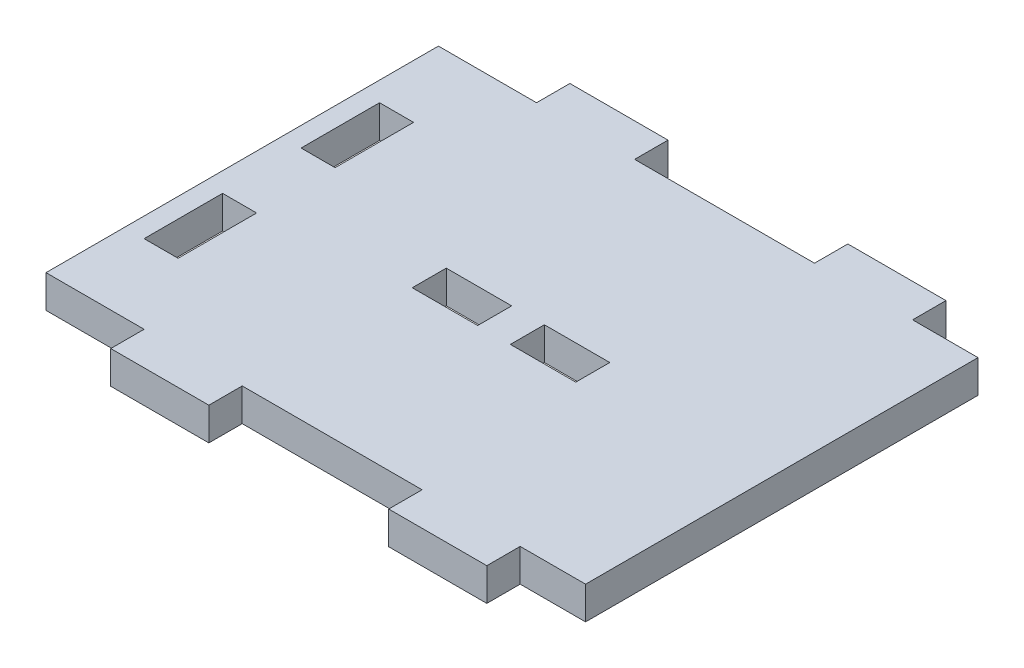
ISO-10303-21;
HEADER;
FILE_DESCRIPTION(('STEP AP214'),'2;1');
FILE_NAME('part.step','',(''),(''),'','','');
FILE_SCHEMA(('AUTOMOTIVE_DESIGN { 1 0 10303 214 1 1 1 1 }'));
ENDSEC;
DATA;
#1=APPLICATION_CONTEXT('core data for automotive mechanical design processes');
#2=APPLICATION_PROTOCOL_DEFINITION('international standard','automotive_design',2000,#1);
#3=PRODUCT_CONTEXT('',#1,'mechanical');
#4=PRODUCT('Part','Part','',(#3));
#5=PRODUCT_RELATED_PRODUCT_CATEGORY('part','',(#4));
#6=PRODUCT_DEFINITION_FORMATION('','',#4);
#7=PRODUCT_DEFINITION_CONTEXT('part definition',#1,'design');
#8=PRODUCT_DEFINITION('design','',#6,#7);
#9=PRODUCT_DEFINITION_SHAPE('','',#8);
#10=(LENGTH_UNIT() NAMED_UNIT(*) SI_UNIT(.MILLI.,.METRE.));
#11=(NAMED_UNIT(*) PLANE_ANGLE_UNIT() SI_UNIT($,.RADIAN.));
#12=(NAMED_UNIT(*) SI_UNIT($,.STERADIAN.) SOLID_ANGLE_UNIT());
#13=UNCERTAINTY_MEASURE_WITH_UNIT(LENGTH_MEASURE(1.E-05),#10,'distance_accuracy_value','');
#14=(GEOMETRIC_REPRESENTATION_CONTEXT(3) GLOBAL_UNCERTAINTY_ASSIGNED_CONTEXT((#13)) GLOBAL_UNIT_ASSIGNED_CONTEXT((#10,
#11,#12)) REPRESENTATION_CONTEXT('',''));
#15=CARTESIAN_POINT('',(0.,0.,0.));
#16=DIRECTION('',(0.,0.,1.));
#17=DIRECTION('',(1.,0.,0.));
#18=AXIS2_PLACEMENT_3D('',#15,#16,#17);
#19=CARTESIAN_POINT('',(0.,5.,0.));
#20=DIRECTION('',(0.,1.,0.));
#21=DIRECTION('',(0.,0.,1.));
#22=AXIS2_PLACEMENT_3D('',#19,#20,#21);
#23=PLANE('',#22);
#24=DIRECTION('',(1.,0.,0.));
#25=VECTOR('',#24,1.);
#26=CARTESIAN_POINT('',(25.,5.,30.));
#27=LINE('',#26,#25);
#28=CARTESIAN_POINT('',(15.,5.,30.));
#29=VERTEX_POINT('',#28);
#30=CARTESIAN_POINT('',(25.,5.,30.));
#31=VERTEX_POINT('',#30);
#32=EDGE_CURVE('E399',#29,#31,#27,.T.);
#33=ORIENTED_EDGE('',*,*,#32,.T.);
#34=DIRECTION('',(0.,0.,-1.));
#35=VECTOR('',#34,1.);
#36=CARTESIAN_POINT('',(25.,5.,-30.));
#37=LINE('',#36,#35);
#38=CARTESIAN_POINT('',(25.,5.,-30.));
#39=VERTEX_POINT('',#38);
#40=EDGE_CURVE('E402',#31,#39,#37,.T.);
#41=ORIENTED_EDGE('',*,*,#40,.T.);
#42=DIRECTION('',(-1.,0.,0.));
#43=VECTOR('',#42,1.);
#44=CARTESIAN_POINT('',(25.,5.,-30.));
#45=LINE('',#44,#43);
#46=CARTESIAN_POINT('',(15.,5.,-30.0000000000001));
#47=VERTEX_POINT('',#46);
#48=EDGE_CURVE('E405',#39,#47,#45,.T.);
#49=ORIENTED_EDGE('',*,*,#48,.T.);
#50=DIRECTION('',(0.,0.,-1.));
#51=VECTOR('',#50,1.);
#52=CARTESIAN_POINT('',(15.,5.,-30.0000000000001));
#53=LINE('',#52,#51);
#54=CARTESIAN_POINT('',(15.,5.,-35.1000000000001));
#55=VERTEX_POINT('',#54);
#56=EDGE_CURVE('E407',#47,#55,#53,.T.);
#57=ORIENTED_EDGE('',*,*,#56,.T.);
#58=DIRECTION('',(-1.,0.,0.));
#59=VECTOR('',#58,1.);
#60=CARTESIAN_POINT('',(15.,5.,-35.1000000000001));
#61=LINE('',#60,#59);
#62=CARTESIAN_POINT('',(0.,5.,-35.1));
#63=VERTEX_POINT('',#62);
#64=EDGE_CURVE('E409',#55,#63,#61,.T.);
#65=ORIENTED_EDGE('',*,*,#64,.T.);
#66=DIRECTION('',(0.,0.,1.));
#67=VECTOR('',#66,1.);
#68=CARTESIAN_POINT('',(0.,5.,-35.1));
#69=LINE('',#68,#67);
#70=CARTESIAN_POINT('',(0.,5.,-30.));
#71=VERTEX_POINT('',#70);
#72=EDGE_CURVE('E411',#63,#71,#69,.T.);
#73=ORIENTED_EDGE('',*,*,#72,.T.);
#74=DIRECTION('',(-1.,0.,0.));
#75=VECTOR('',#74,1.);
#76=CARTESIAN_POINT('',(0.,5.,-30.));
#77=LINE('',#76,#75);
#78=CARTESIAN_POINT('',(-27.5,5.,-30.));
#79=VERTEX_POINT('',#78);
#80=EDGE_CURVE('E413',#71,#79,#77,.T.);
#81=ORIENTED_EDGE('',*,*,#80,.T.);
#82=DIRECTION('',(0.,0.,-1.));
#83=VECTOR('',#82,1.);
#84=CARTESIAN_POINT('',(-27.5,5.,-30.));
#85=LINE('',#84,#83);
#86=CARTESIAN_POINT('',(-27.5,5.,-35.1));
#87=VERTEX_POINT('',#86);
#88=EDGE_CURVE('E415',#79,#87,#85,.T.);
#89=ORIENTED_EDGE('',*,*,#88,.T.);
#90=DIRECTION('',(-1.,0.,0.));
#91=VECTOR('',#90,1.);
#92=CARTESIAN_POINT('',(-27.5,5.,-35.1));
#93=LINE('',#92,#91);
#94=CARTESIAN_POINT('',(-42.5,5.,-35.1));
#95=VERTEX_POINT('',#94);
#96=EDGE_CURVE('E417',#87,#95,#93,.T.);
#97=ORIENTED_EDGE('',*,*,#96,.T.);
#98=DIRECTION('',(0.,0.,1.));
#99=VECTOR('',#98,1.);
#100=CARTESIAN_POINT('',(-42.5,5.,-35.1));
#101=LINE('',#100,#99);
#102=CARTESIAN_POINT('',(-42.5,5.,-30.));
#103=VERTEX_POINT('',#102);
#104=EDGE_CURVE('E419',#95,#103,#101,.T.);
#105=ORIENTED_EDGE('',*,*,#104,.T.);
#106=DIRECTION('',(-1.,0.,0.));
#107=VECTOR('',#106,1.);
#108=CARTESIAN_POINT('',(-42.5,5.,-30.));
#109=LINE('',#108,#107);
#110=CARTESIAN_POINT('',(-57.5,5.,-30.));
#111=VERTEX_POINT('',#110);
#112=EDGE_CURVE('E421',#103,#111,#109,.T.);
#113=ORIENTED_EDGE('',*,*,#112,.T.);
#114=DIRECTION('',(0.,0.,1.));
#115=VECTOR('',#114,1.);
#116=CARTESIAN_POINT('',(-57.5,5.,30.));
#117=LINE('',#116,#115);
#118=CARTESIAN_POINT('',(-57.5,5.,30.));
#119=VERTEX_POINT('',#118);
#120=EDGE_CURVE('E423',#111,#119,#117,.T.);
#121=ORIENTED_EDGE('',*,*,#120,.T.);
#122=DIRECTION('',(1.,0.,0.));
#123=VECTOR('',#122,1.);
#124=CARTESIAN_POINT('',(-42.5,5.,30.));
#125=LINE('',#124,#123);
#126=CARTESIAN_POINT('',(-42.5,5.,30.));
#127=VERTEX_POINT('',#126);
#128=EDGE_CURVE('E425',#119,#127,#125,.T.);
#129=ORIENTED_EDGE('',*,*,#128,.T.);
#130=DIRECTION('',(0.,0.,1.));
#131=VECTOR('',#130,1.);
#132=CARTESIAN_POINT('',(-42.5,5.,35.1));
#133=LINE('',#132,#131);
#134=CARTESIAN_POINT('',(-42.5,5.,35.1));
#135=VERTEX_POINT('',#134);
#136=EDGE_CURVE('E427',#127,#135,#133,.T.);
#137=ORIENTED_EDGE('',*,*,#136,.T.);
#138=DIRECTION('',(1.,0.,0.));
#139=VECTOR('',#138,1.);
#140=CARTESIAN_POINT('',(-27.5,5.,35.1));
#141=LINE('',#140,#139);
#142=CARTESIAN_POINT('',(-27.5,5.,35.1));
#143=VERTEX_POINT('',#142);
#144=EDGE_CURVE('E429',#135,#143,#141,.T.);
#145=ORIENTED_EDGE('',*,*,#144,.T.);
#146=DIRECTION('',(0.,0.,-1.));
#147=VECTOR('',#146,1.);
#148=CARTESIAN_POINT('',(-27.5,5.,30.));
#149=LINE('',#148,#147);
#150=CARTESIAN_POINT('',(-27.5,5.,30.));
#151=VERTEX_POINT('',#150);
#152=EDGE_CURVE('E431',#143,#151,#149,.T.);
#153=ORIENTED_EDGE('',*,*,#152,.T.);
#154=DIRECTION('',(1.,0.,0.));
#155=VECTOR('',#154,1.);
#156=CARTESIAN_POINT('',(0.,5.,30.));
#157=LINE('',#156,#155);
#158=CARTESIAN_POINT('',(0.,5.,30.));
#159=VERTEX_POINT('',#158);
#160=EDGE_CURVE('E433',#151,#159,#157,.T.);
#161=ORIENTED_EDGE('',*,*,#160,.T.);
#162=DIRECTION('',(0.,0.,1.));
#163=VECTOR('',#162,1.);
#164=CARTESIAN_POINT('',(0.,5.,35.1));
#165=LINE('',#164,#163);
#166=CARTESIAN_POINT('',(0.,5.,35.1));
#167=VERTEX_POINT('',#166);
#168=EDGE_CURVE('E435',#159,#167,#165,.T.);
#169=ORIENTED_EDGE('',*,*,#168,.T.);
#170=DIRECTION('',(1.,0.,0.));
#171=VECTOR('',#170,1.);
#172=CARTESIAN_POINT('',(15.,5.,35.1));
#173=LINE('',#172,#171);
#174=CARTESIAN_POINT('',(15.,5.,35.1));
#175=VERTEX_POINT('',#174);
#176=EDGE_CURVE('E437',#167,#175,#173,.T.);
#177=ORIENTED_EDGE('',*,*,#176,.T.);
#178=DIRECTION('',(0.,0.,-1.));
#179=VECTOR('',#178,1.);
#180=CARTESIAN_POINT('',(15.,5.,30.));
#181=LINE('',#180,#179);
#182=EDGE_CURVE('E439',#175,#29,#181,.T.);
#183=ORIENTED_EDGE('',*,*,#182,.T.);
#184=EDGE_LOOP('',(#33,#41,#49,#57,#65,#73,#81,#89,#97,#105,#113,#121,#129,#137,#145,#153,#161,
#169,#177,#183));
#185=FACE_BOUND('',#184,.T.);
#186=DIRECTION('',(-1.,0.,0.));
#187=VECTOR('',#186,1.);
#188=CARTESIAN_POINT('',(-27.5,5.,-1.2));
#189=LINE('',#188,#187);
#190=CARTESIAN_POINT('',(-17.5,5.,-1.2));
#191=VERTEX_POINT('',#190);
#192=CARTESIAN_POINT('',(-27.5,5.,-1.2));
#193=VERTEX_POINT('',#192);
#194=EDGE_CURVE('E370',#191,#193,#189,.T.);
#195=ORIENTED_EDGE('',*,*,#194,.F.);
#196=DIRECTION('',(0.,0.,-1.));
#197=VECTOR('',#196,1.);
#198=CARTESIAN_POINT('',(-17.5,5.,-1.2));
#199=LINE('',#198,#197);
#200=CARTESIAN_POINT('',(-17.5,5.,4.));
#201=VERTEX_POINT('',#200);
#202=EDGE_CURVE('E368',#201,#191,#199,.T.);
#203=ORIENTED_EDGE('',*,*,#202,.F.);
#204=DIRECTION('',(1.,0.,0.));
#205=VECTOR('',#204,1.);
#206=CARTESIAN_POINT('',(-27.5,5.,4.));
#207=LINE('',#206,#205);
#208=CARTESIAN_POINT('',(-27.5,5.,4.));
#209=VERTEX_POINT('',#208);
#210=EDGE_CURVE('E376',#209,#201,#207,.T.);
#211=ORIENTED_EDGE('',*,*,#210,.F.);
#212=DIRECTION('',(0.,0.,1.));
#213=VECTOR('',#212,1.);
#214=CARTESIAN_POINT('',(-27.5,5.,-1.2));
#215=LINE('',#214,#213);
#216=EDGE_CURVE('E373',#193,#209,#215,.T.);
#217=ORIENTED_EDGE('',*,*,#216,.F.);
#218=EDGE_LOOP('',(#195,#203,#211,#217));
#219=FACE_BOUND('',#218,.T.);
#220=DIRECTION('',(-1.,0.,0.));
#221=VECTOR('',#220,1.);
#222=CARTESIAN_POINT('',(-12.5,5.,-1.2));
#223=LINE('',#222,#221);
#224=CARTESIAN_POINT('',(-2.50000000000002,5.,-1.2));
#225=VERTEX_POINT('',#224);
#226=CARTESIAN_POINT('',(-12.5,5.,-1.2));
#227=VERTEX_POINT('',#226);
#228=EDGE_CURVE('E339',#225,#227,#223,.T.);
#229=ORIENTED_EDGE('',*,*,#228,.F.);
#230=DIRECTION('',(0.,0.,-1.));
#231=VECTOR('',#230,1.);
#232=CARTESIAN_POINT('',(-2.50000000000002,5.,-1.2));
#233=LINE('',#232,#231);
#234=CARTESIAN_POINT('',(-2.50000000000001,5.,4.));
#235=VERTEX_POINT('',#234);
#236=EDGE_CURVE('E337',#235,#225,#233,.T.);
#237=ORIENTED_EDGE('',*,*,#236,.F.);
#238=DIRECTION('',(1.,0.,0.));
#239=VECTOR('',#238,1.);
#240=CARTESIAN_POINT('',(-12.5,5.,4.));
#241=LINE('',#240,#239);
#242=CARTESIAN_POINT('',(-12.5,5.,4.));
#243=VERTEX_POINT('',#242);
#244=EDGE_CURVE('E345',#243,#235,#241,.T.);
#245=ORIENTED_EDGE('',*,*,#244,.F.);
#246=DIRECTION('',(0.,0.,1.));
#247=VECTOR('',#246,1.);
#248=CARTESIAN_POINT('',(-12.5,5.,-1.2));
#249=LINE('',#248,#247);
#250=EDGE_CURVE('E342',#227,#243,#249,.T.);
#251=ORIENTED_EDGE('',*,*,#250,.F.);
#252=EDGE_LOOP('',(#229,#237,#245,#251));
#253=FACE_BOUND('',#252,.T.);
#254=DIRECTION('',(-1.,0.,0.));
#255=VECTOR('',#254,1.);
#256=CARTESIAN_POINT('',(-54.5,5.,6.00000000000001));
#257=LINE('',#256,#255);
#258=CARTESIAN_POINT('',(-49.3,5.,6.00000000000001));
#259=VERTEX_POINT('',#258);
#260=CARTESIAN_POINT('',(-54.5,5.,6.00000000000001));
#261=VERTEX_POINT('',#260);
#262=EDGE_CURVE('E308',#259,#261,#257,.T.);
#263=ORIENTED_EDGE('',*,*,#262,.F.);
#264=DIRECTION('',(0.,0.,-1.));
#265=VECTOR('',#264,1.);
#266=CARTESIAN_POINT('',(-49.3,5.,6.00000000000001));
#267=LINE('',#266,#265);
#268=CARTESIAN_POINT('',(-49.3,5.,18.));
#269=VERTEX_POINT('',#268);
#270=EDGE_CURVE('E306',#269,#259,#267,.T.);
#271=ORIENTED_EDGE('',*,*,#270,.F.);
#272=DIRECTION('',(1.,0.,0.));
#273=VECTOR('',#272,1.);
#274=CARTESIAN_POINT('',(-54.5,5.,18.));
#275=LINE('',#274,#273);
#276=CARTESIAN_POINT('',(-54.5,5.,18.));
#277=VERTEX_POINT('',#276);
#278=EDGE_CURVE('E314',#277,#269,#275,.T.);
#279=ORIENTED_EDGE('',*,*,#278,.F.);
#280=DIRECTION('',(0.,0.,1.));
#281=VECTOR('',#280,1.);
#282=CARTESIAN_POINT('',(-54.5,5.,6.00000000000001));
#283=LINE('',#282,#281);
#284=EDGE_CURVE('E311',#261,#277,#283,.T.);
#285=ORIENTED_EDGE('',*,*,#284,.F.);
#286=EDGE_LOOP('',(#263,#271,#279,#285));
#287=FACE_BOUND('',#286,.T.);
#288=DIRECTION('',(1.,0.,0.));
#289=VECTOR('',#288,1.);
#290=CARTESIAN_POINT('',(-54.5,5.,-6.00000000000001));
#291=LINE('',#290,#289);
#292=CARTESIAN_POINT('',(-54.5,5.,-6.00000000000001));
#293=VERTEX_POINT('',#292);
#294=CARTESIAN_POINT('',(-49.3,5.,-6.00000000000002));
#295=VERTEX_POINT('',#294);
#296=EDGE_CURVE('E278',#293,#295,#291,.T.);
#297=ORIENTED_EDGE('',*,*,#296,.F.);
#298=DIRECTION('',(0.,0.,1.));
#299=VECTOR('',#298,1.);
#300=CARTESIAN_POINT('',(-54.5,5.,-6.00000000000001));
#301=LINE('',#300,#299);
#302=CARTESIAN_POINT('',(-54.5000000000001,5.,-18.));
#303=VERTEX_POINT('',#302);
#304=EDGE_CURVE('E270',#303,#293,#301,.T.);
#305=ORIENTED_EDGE('',*,*,#304,.F.);
#306=DIRECTION('',(-1.,0.,0.));
#307=VECTOR('',#306,1.);
#308=CARTESIAN_POINT('',(-54.5000000000001,5.,-18.));
#309=LINE('',#308,#307);
#310=CARTESIAN_POINT('',(-49.3000000000001,5.,-18.));
#311=VERTEX_POINT('',#310);
#312=EDGE_CURVE('E292',#311,#303,#309,.T.);
#313=ORIENTED_EDGE('',*,*,#312,.F.);
#314=DIRECTION('',(0.,0.,-1.));
#315=VECTOR('',#314,1.);
#316=CARTESIAN_POINT('',(-49.3,5.,-6.00000000000002));
#317=LINE('',#316,#315);
#318=EDGE_CURVE('E290',#295,#311,#317,.T.);
#319=ORIENTED_EDGE('',*,*,#318,.F.);
#320=EDGE_LOOP('',(#297,#305,#313,#319));
#321=FACE_BOUND('',#320,.T.);
#322=ADVANCED_FACE('F37',(#185,#219,#253,#287,#321),#23,.T.);
#323=CARTESIAN_POINT('',(0.,0.,0.));
#324=DIRECTION('',(0.,1.,0.));
#325=DIRECTION('',(0.,0.,1.));
#326=AXIS2_PLACEMENT_3D('',#323,#324,#325);
#327=PLANE('',#326);
#328=DIRECTION('',(0.,0.,-1.));
#329=VECTOR('',#328,1.);
#330=CARTESIAN_POINT('',(-49.3,0.,6.00000000000001));
#331=LINE('',#330,#329);
#332=CARTESIAN_POINT('',(-49.3,0.,18.));
#333=VERTEX_POINT('',#332);
#334=CARTESIAN_POINT('',(-49.3,0.,6.00000000000001));
#335=VERTEX_POINT('',#334);
#336=EDGE_CURVE('E286',#333,#335,#331,.T.);
#337=ORIENTED_EDGE('',*,*,#336,.T.);
#338=DIRECTION('',(-1.,0.,0.));
#339=VECTOR('',#338,1.);
#340=CARTESIAN_POINT('',(-54.5,0.,6.00000000000001));
#341=LINE('',#340,#339);
#342=CARTESIAN_POINT('',(-54.5,0.,6.00000000000001));
#343=VERTEX_POINT('',#342);
#344=EDGE_CURVE('E319',#335,#343,#341,.T.);
#345=ORIENTED_EDGE('',*,*,#344,.T.);
#346=DIRECTION('',(0.,0.,1.));
#347=VECTOR('',#346,1.);
#348=CARTESIAN_POINT('',(-54.5,0.,6.00000000000001));
#349=LINE('',#348,#347);
#350=CARTESIAN_POINT('',(-54.5,0.,18.));
#351=VERTEX_POINT('',#350);
#352=EDGE_CURVE('E322',#343,#351,#349,.T.);
#353=ORIENTED_EDGE('',*,*,#352,.T.);
#354=DIRECTION('',(1.,0.,0.));
#355=VECTOR('',#354,1.);
#356=CARTESIAN_POINT('',(-54.5,0.,18.));
#357=LINE('',#356,#355);
#358=EDGE_CURVE('E309',#351,#333,#357,.T.);
#359=ORIENTED_EDGE('',*,*,#358,.T.);
#360=EDGE_LOOP('',(#337,#345,#353,#359));
#361=FACE_BOUND('',#360,.T.);
#362=DIRECTION('',(0.,0.,-1.));
#363=VECTOR('',#362,1.);
#364=CARTESIAN_POINT('',(-17.5,0.,-1.2));
#365=LINE('',#364,#363);
#366=CARTESIAN_POINT('',(-17.5,0.,4.));
#367=VERTEX_POINT('',#366);
#368=CARTESIAN_POINT('',(-17.5,0.,-1.2));
#369=VERTEX_POINT('',#368);
#370=EDGE_CURVE('E367',#367,#369,#365,.T.);
#371=ORIENTED_EDGE('',*,*,#370,.T.);
#372=DIRECTION('',(-1.,0.,0.));
#373=VECTOR('',#372,1.);
#374=CARTESIAN_POINT('',(-27.5,0.,-1.2));
#375=LINE('',#374,#373);
#376=CARTESIAN_POINT('',(-27.5,0.,-1.2));
#377=VERTEX_POINT('',#376);
#378=EDGE_CURVE('E381',#369,#377,#375,.T.);
#379=ORIENTED_EDGE('',*,*,#378,.T.);
#380=DIRECTION('',(0.,0.,1.));
#381=VECTOR('',#380,1.);
#382=CARTESIAN_POINT('',(-27.5,0.,-1.2));
#383=LINE('',#382,#381);
#384=CARTESIAN_POINT('',(-27.5,0.,4.));
#385=VERTEX_POINT('',#384);
#386=EDGE_CURVE('E384',#377,#385,#383,.T.);
#387=ORIENTED_EDGE('',*,*,#386,.T.);
#388=DIRECTION('',(1.,0.,0.));
#389=VECTOR('',#388,1.);
#390=CARTESIAN_POINT('',(-27.5,0.,4.));
#391=LINE('',#390,#389);
#392=EDGE_CURVE('E371',#385,#367,#391,.T.);
#393=ORIENTED_EDGE('',*,*,#392,.T.);
#394=EDGE_LOOP('',(#371,#379,#387,#393));
#395=FACE_BOUND('',#394,.T.);
#396=DIRECTION('',(1.,0.,0.));
#397=VECTOR('',#396,1.);
#398=CARTESIAN_POINT('',(25.,0.,30.));
#399=LINE('',#398,#397);
#400=CARTESIAN_POINT('',(15.,0.,30.));
#401=VERTEX_POINT('',#400);
#402=CARTESIAN_POINT('',(25.,0.,30.));
#403=VERTEX_POINT('',#402);
#404=EDGE_CURVE('E398',#401,#403,#399,.T.);
#405=ORIENTED_EDGE('',*,*,#404,.F.);
#406=DIRECTION('',(0.,0.,-1.));
#407=VECTOR('',#406,1.);
#408=CARTESIAN_POINT('',(15.,0.,30.));
#409=LINE('',#408,#407);
#410=CARTESIAN_POINT('',(15.,0.,35.1));
#411=VERTEX_POINT('',#410);
#412=EDGE_CURVE('E403',#411,#401,#409,.T.);
#413=ORIENTED_EDGE('',*,*,#412,.F.);
#414=DIRECTION('',(1.,0.,0.));
#415=VECTOR('',#414,1.);
#416=CARTESIAN_POINT('',(15.,0.,35.1));
#417=LINE('',#416,#415);
#418=CARTESIAN_POINT('',(0.,0.,35.1));
#419=VERTEX_POINT('',#418);
#420=EDGE_CURVE('E478',#419,#411,#417,.T.);
#421=ORIENTED_EDGE('',*,*,#420,.F.);
#422=DIRECTION('',(0.,0.,1.));
#423=VECTOR('',#422,1.);
#424=CARTESIAN_POINT('',(0.,0.,35.1));
#425=LINE('',#424,#423);
#426=CARTESIAN_POINT('',(0.,0.,30.));
#427=VERTEX_POINT('',#426);
#428=EDGE_CURVE('E476',#427,#419,#425,.T.);
#429=ORIENTED_EDGE('',*,*,#428,.F.);
#430=DIRECTION('',(1.,0.,0.));
#431=VECTOR('',#430,1.);
#432=CARTESIAN_POINT('',(0.,0.,30.));
#433=LINE('',#432,#431);
#434=CARTESIAN_POINT('',(-27.5,0.,30.));
#435=VERTEX_POINT('',#434);
#436=EDGE_CURVE('E474',#435,#427,#433,.T.);
#437=ORIENTED_EDGE('',*,*,#436,.F.);
#438=DIRECTION('',(0.,0.,-1.));
#439=VECTOR('',#438,1.);
#440=CARTESIAN_POINT('',(-27.5,0.,30.));
#441=LINE('',#440,#439);
#442=CARTESIAN_POINT('',(-27.5,0.,35.1));
#443=VERTEX_POINT('',#442);
#444=EDGE_CURVE('E472',#443,#435,#441,.T.);
#445=ORIENTED_EDGE('',*,*,#444,.F.);
#446=DIRECTION('',(1.,0.,0.));
#447=VECTOR('',#446,1.);
#448=CARTESIAN_POINT('',(-27.5,0.,35.1));
#449=LINE('',#448,#447);
#450=CARTESIAN_POINT('',(-42.5,0.,35.1));
#451=VERTEX_POINT('',#450);
#452=EDGE_CURVE('E470',#451,#443,#449,.T.);
#453=ORIENTED_EDGE('',*,*,#452,.F.);
#454=DIRECTION('',(0.,0.,1.));
#455=VECTOR('',#454,1.);
#456=CARTESIAN_POINT('',(-42.5,0.,35.1));
#457=LINE('',#456,#455);
#458=CARTESIAN_POINT('',(-42.5,0.,30.));
#459=VERTEX_POINT('',#458);
#460=EDGE_CURVE('E468',#459,#451,#457,.T.);
#461=ORIENTED_EDGE('',*,*,#460,.F.);
#462=DIRECTION('',(1.,0.,0.));
#463=VECTOR('',#462,1.);
#464=CARTESIAN_POINT('',(-42.5,0.,30.));
#465=LINE('',#464,#463);
#466=CARTESIAN_POINT('',(-57.5,0.,30.));
#467=VERTEX_POINT('',#466);
#468=EDGE_CURVE('E466',#467,#459,#465,.T.);
#469=ORIENTED_EDGE('',*,*,#468,.F.);
#470=DIRECTION('',(0.,0.,1.));
#471=VECTOR('',#470,1.);
#472=CARTESIAN_POINT('',(-57.5,0.,30.));
#473=LINE('',#472,#471);
#474=CARTESIAN_POINT('',(-57.5,0.,-30.));
#475=VERTEX_POINT('',#474);
#476=EDGE_CURVE('E464',#475,#467,#473,.T.);
#477=ORIENTED_EDGE('',*,*,#476,.F.);
#478=DIRECTION('',(-1.,0.,0.));
#479=VECTOR('',#478,1.);
#480=CARTESIAN_POINT('',(-42.5,0.,-30.));
#481=LINE('',#480,#479);
#482=CARTESIAN_POINT('',(-42.5,0.,-30.));
#483=VERTEX_POINT('',#482);
#484=EDGE_CURVE('E462',#483,#475,#481,.T.);
#485=ORIENTED_EDGE('',*,*,#484,.F.);
#486=DIRECTION('',(0.,0.,1.));
#487=VECTOR('',#486,1.);
#488=CARTESIAN_POINT('',(-42.5,0.,-35.1));
#489=LINE('',#488,#487);
#490=CARTESIAN_POINT('',(-42.5,0.,-35.1));
#491=VERTEX_POINT('',#490);
#492=EDGE_CURVE('E460',#491,#483,#489,.T.);
#493=ORIENTED_EDGE('',*,*,#492,.F.);
#494=DIRECTION('',(-1.,0.,0.));
#495=VECTOR('',#494,1.);
#496=CARTESIAN_POINT('',(-27.5,0.,-35.1));
#497=LINE('',#496,#495);
#498=CARTESIAN_POINT('',(-27.5,0.,-35.1));
#499=VERTEX_POINT('',#498);
#500=EDGE_CURVE('E458',#499,#491,#497,.T.);
#501=ORIENTED_EDGE('',*,*,#500,.F.);
#502=DIRECTION('',(0.,0.,-1.));
#503=VECTOR('',#502,1.);
#504=CARTESIAN_POINT('',(-27.5,0.,-30.));
#505=LINE('',#504,#503);
#506=CARTESIAN_POINT('',(-27.5,0.,-30.));
#507=VERTEX_POINT('',#506);
#508=EDGE_CURVE('E456',#507,#499,#505,.T.);
#509=ORIENTED_EDGE('',*,*,#508,.F.);
#510=DIRECTION('',(-1.,0.,0.));
#511=VECTOR('',#510,1.);
#512=CARTESIAN_POINT('',(0.,0.,-30.));
#513=LINE('',#512,#511);
#514=CARTESIAN_POINT('',(0.,0.,-30.));
#515=VERTEX_POINT('',#514);
#516=EDGE_CURVE('E454',#515,#507,#513,.T.);
#517=ORIENTED_EDGE('',*,*,#516,.F.);
#518=DIRECTION('',(0.,0.,1.));
#519=VECTOR('',#518,1.);
#520=CARTESIAN_POINT('',(0.,0.,-35.1));
#521=LINE('',#520,#519);
#522=CARTESIAN_POINT('',(0.,0.,-35.1));
#523=VERTEX_POINT('',#522);
#524=EDGE_CURVE('E452',#523,#515,#521,.T.);
#525=ORIENTED_EDGE('',*,*,#524,.F.);
#526=DIRECTION('',(-1.,0.,0.));
#527=VECTOR('',#526,1.);
#528=CARTESIAN_POINT('',(15.,0.,-35.1000000000001));
#529=LINE('',#528,#527);
#530=CARTESIAN_POINT('',(15.,0.,-35.1000000000001));
#531=VERTEX_POINT('',#530);
#532=EDGE_CURVE('E450',#531,#523,#529,.T.);
#533=ORIENTED_EDGE('',*,*,#532,.F.);
#534=DIRECTION('',(0.,0.,-1.));
#535=VECTOR('',#534,1.);
#536=CARTESIAN_POINT('',(15.,0.,-30.0000000000001));
#537=LINE('',#536,#535);
#538=CARTESIAN_POINT('',(15.,0.,-30.0000000000001));
#539=VERTEX_POINT('',#538);
#540=EDGE_CURVE('E448',#539,#531,#537,.T.);
#541=ORIENTED_EDGE('',*,*,#540,.F.);
#542=DIRECTION('',(-1.,0.,0.));
#543=VECTOR('',#542,1.);
#544=CARTESIAN_POINT('',(25.,0.,-30.));
#545=LINE('',#544,#543);
#546=CARTESIAN_POINT('',(25.,0.,-30.));
#547=VERTEX_POINT('',#546);
#548=EDGE_CURVE('E446',#547,#539,#545,.T.);
#549=ORIENTED_EDGE('',*,*,#548,.F.);
#550=DIRECTION('',(0.,0.,-1.));
#551=VECTOR('',#550,1.);
#552=CARTESIAN_POINT('',(25.,0.,-30.));
#553=LINE('',#552,#551);
#554=EDGE_CURVE('E444',#403,#547,#553,.T.);
#555=ORIENTED_EDGE('',*,*,#554,.F.);
#556=EDGE_LOOP('',(#405,#413,#421,#429,#437,#445,#453,#461,#469,#477,#485,#493,#501,#509,#517,
#525,#533,#541,#549,#555));
#557=FACE_BOUND('',#556,.T.);
#558=DIRECTION('',(0.,0.,-1.));
#559=VECTOR('',#558,1.);
#560=CARTESIAN_POINT('',(-2.50000000000002,0.,-1.2));
#561=LINE('',#560,#559);
#562=CARTESIAN_POINT('',(-2.50000000000001,0.,4.));
#563=VERTEX_POINT('',#562);
#564=CARTESIAN_POINT('',(-2.50000000000002,0.,-1.2));
#565=VERTEX_POINT('',#564);
#566=EDGE_CURVE('E336',#563,#565,#561,.T.);
#567=ORIENTED_EDGE('',*,*,#566,.T.);
#568=DIRECTION('',(-1.,0.,0.));
#569=VECTOR('',#568,1.);
#570=CARTESIAN_POINT('',(-12.5,0.,-1.2));
#571=LINE('',#570,#569);
#572=CARTESIAN_POINT('',(-12.5,0.,-1.2));
#573=VERTEX_POINT('',#572);
#574=EDGE_CURVE('E350',#565,#573,#571,.T.);
#575=ORIENTED_EDGE('',*,*,#574,.T.);
#576=DIRECTION('',(0.,0.,1.));
#577=VECTOR('',#576,1.);
#578=CARTESIAN_POINT('',(-12.5,0.,-1.2));
#579=LINE('',#578,#577);
#580=CARTESIAN_POINT('',(-12.5,0.,4.));
#581=VERTEX_POINT('',#580);
#582=EDGE_CURVE('E353',#573,#581,#579,.T.);
#583=ORIENTED_EDGE('',*,*,#582,.T.);
#584=DIRECTION('',(1.,0.,0.));
#585=VECTOR('',#584,1.);
#586=CARTESIAN_POINT('',(-12.5,0.,4.));
#587=LINE('',#586,#585);
#588=EDGE_CURVE('E340',#581,#563,#587,.T.);
#589=ORIENTED_EDGE('',*,*,#588,.T.);
#590=EDGE_LOOP('',(#567,#575,#583,#589));
#591=FACE_BOUND('',#590,.T.);
#592=DIRECTION('',(0.,0.,1.));
#593=VECTOR('',#592,1.);
#594=CARTESIAN_POINT('',(-54.5,0.,-6.00000000000001));
#595=LINE('',#594,#593);
#596=CARTESIAN_POINT('',(-54.5000000000001,0.,-18.));
#597=VERTEX_POINT('',#596);
#598=CARTESIAN_POINT('',(-54.5,0.,-6.00000000000001));
#599=VERTEX_POINT('',#598);
#600=EDGE_CURVE('E60',#597,#599,#595,.T.);
#601=ORIENTED_EDGE('',*,*,#600,.T.);
#602=DIRECTION('',(1.,0.,0.));
#603=VECTOR('',#602,1.);
#604=CARTESIAN_POINT('',(-54.5,0.,-6.00000000000001));
#605=LINE('',#604,#603);
#606=CARTESIAN_POINT('',(-49.3,0.,-6.00000000000002));
#607=VERTEX_POINT('',#606);
#608=EDGE_CURVE('E285',#599,#607,#605,.T.);
#609=ORIENTED_EDGE('',*,*,#608,.T.);
#610=DIRECTION('',(0.,0.,-1.));
#611=VECTOR('',#610,1.);
#612=CARTESIAN_POINT('',(-49.3,0.,-6.00000000000002));
#613=LINE('',#612,#611);
#614=CARTESIAN_POINT('',(-49.3000000000001,0.,-18.));
#615=VERTEX_POINT('',#614);
#616=EDGE_CURVE('E298',#607,#615,#613,.T.);
#617=ORIENTED_EDGE('',*,*,#616,.T.);
#618=DIRECTION('',(-1.,0.,0.));
#619=VECTOR('',#618,1.);
#620=CARTESIAN_POINT('',(-54.5000000000001,0.,-18.));
#621=LINE('',#620,#619);
#622=EDGE_CURVE('E279',#615,#597,#621,.T.);
#623=ORIENTED_EDGE('',*,*,#622,.T.);
#624=EDGE_LOOP('',(#601,#609,#617,#623));
#625=FACE_BOUND('',#624,.T.);
#626=ADVANCED_FACE('F544',(#361,#395,#557,#591,#625),#327,.F.);
#627=CARTESIAN_POINT('',(25.,5.,30.));
#628=DIRECTION('',(0.,0.,-1.));
#629=DIRECTION('',(-1.,0.,0.));
#630=AXIS2_PLACEMENT_3D('',#627,#628,#629);
#631=PLANE('',#630);
#632=ORIENTED_EDGE('',*,*,#404,.T.);
#633=DIRECTION('',(0.,-1.,0.));
#634=VECTOR('',#633,1.);
#635=CARTESIAN_POINT('',(25.,5.,30.));
#636=LINE('',#635,#634);
#637=EDGE_CURVE('E11',#31,#403,#636,.T.);
#638=ORIENTED_EDGE('',*,*,#637,.F.);
#639=ORIENTED_EDGE('',*,*,#32,.F.);
#640=DIRECTION('',(0.,-1.,0.));
#641=VECTOR('',#640,1.);
#642=CARTESIAN_POINT('',(15.,5.,30.));
#643=LINE('',#642,#641);
#644=EDGE_CURVE('E441',#29,#401,#643,.T.);
#645=ORIENTED_EDGE('',*,*,#644,.T.);
#646=EDGE_LOOP('',(#632,#638,#639,#645));
#647=FACE_BOUND('',#646,.T.);
#648=ADVANCED_FACE('F39',(#647),#631,.F.);
#649=CARTESIAN_POINT('',(25.,5.,-30.));
#650=DIRECTION('',(-1.,0.,0.));
#651=DIRECTION('',(0.,0.,1.));
#652=AXIS2_PLACEMENT_3D('',#649,#650,#651);
#653=PLANE('',#652);
#654=ORIENTED_EDGE('',*,*,#554,.T.);
#655=DIRECTION('',(0.,-1.,0.));
#656=VECTOR('',#655,1.);
#657=CARTESIAN_POINT('',(25.,5.,-30.));
#658=LINE('',#657,#656);
#659=EDGE_CURVE('E45',#39,#547,#658,.T.);
#660=ORIENTED_EDGE('',*,*,#659,.F.);
#661=ORIENTED_EDGE('',*,*,#40,.F.);
#662=ORIENTED_EDGE('',*,*,#637,.T.);
#663=EDGE_LOOP('',(#654,#660,#661,#662));
#664=FACE_BOUND('',#663,.T.);
#665=ADVANCED_FACE('F562',(#664),#653,.F.);
#666=CARTESIAN_POINT('',(25.,5.,-30.));
#667=DIRECTION('',(0.,0.,1.));
#668=DIRECTION('',(1.,0.,0.));
#669=AXIS2_PLACEMENT_3D('',#666,#667,#668);
#670=PLANE('',#669);
#671=ORIENTED_EDGE('',*,*,#548,.T.);
#672=DIRECTION('',(0.,-1.,0.));
#673=VECTOR('',#672,1.);
#674=CARTESIAN_POINT('',(15.,5.,-30.0000000000001));
#675=LINE('',#674,#673);
#676=EDGE_CURVE('E531',#47,#539,#675,.T.);
#677=ORIENTED_EDGE('',*,*,#676,.F.);
#678=ORIENTED_EDGE('',*,*,#48,.F.);
#679=ORIENTED_EDGE('',*,*,#659,.T.);
#680=EDGE_LOOP('',(#671,#677,#678,#679));
#681=FACE_BOUND('',#680,.T.);
#682=ADVANCED_FACE('F538',(#681),#670,.F.);
#683=CARTESIAN_POINT('',(15.,5.,-30.0000000000001));
#684=DIRECTION('',(-1.,0.,0.));
#685=DIRECTION('',(0.,0.,1.));
#686=AXIS2_PLACEMENT_3D('',#683,#684,#685);
#687=PLANE('',#686);
#688=ORIENTED_EDGE('',*,*,#540,.T.);
#689=DIRECTION('',(0.,-1.,0.));
#690=VECTOR('',#689,1.);
#691=CARTESIAN_POINT('',(15.,5.,-35.1000000000001));
#692=LINE('',#691,#690);
#693=EDGE_CURVE('E528',#55,#531,#692,.T.);
#694=ORIENTED_EDGE('',*,*,#693,.F.);
#695=ORIENTED_EDGE('',*,*,#56,.F.);
#696=ORIENTED_EDGE('',*,*,#676,.T.);
#697=EDGE_LOOP('',(#688,#694,#695,#696));
#698=FACE_BOUND('',#697,.T.);
#699=ADVANCED_FACE('F550',(#698),#687,.F.);
#700=CARTESIAN_POINT('',(15.,5.,-35.1000000000001));
#701=DIRECTION('',(0.,0.,1.));
#702=DIRECTION('',(1.,0.,0.));
#703=AXIS2_PLACEMENT_3D('',#700,#701,#702);
#704=PLANE('',#703);
#705=ORIENTED_EDGE('',*,*,#532,.T.);
#706=DIRECTION('',(0.,-1.,0.));
#707=VECTOR('',#706,1.);
#708=CARTESIAN_POINT('',(0.,5.,-35.1));
#709=LINE('',#708,#707);
#710=EDGE_CURVE('E525',#63,#523,#709,.T.);
#711=ORIENTED_EDGE('',*,*,#710,.F.);
#712=ORIENTED_EDGE('',*,*,#64,.F.);
#713=ORIENTED_EDGE('',*,*,#693,.T.);
#714=EDGE_LOOP('',(#705,#711,#712,#713));
#715=FACE_BOUND('',#714,.T.);
#716=ADVANCED_FACE('F554',(#715),#704,.F.);
#717=CARTESIAN_POINT('',(0.,5.,-35.1));
#718=DIRECTION('',(1.,0.,0.));
#719=DIRECTION('',(0.,0.,-1.));
#720=AXIS2_PLACEMENT_3D('',#717,#718,#719);
#721=PLANE('',#720);
#722=ORIENTED_EDGE('',*,*,#524,.T.);
#723=DIRECTION('',(0.,-1.,0.));
#724=VECTOR('',#723,1.);
#725=CARTESIAN_POINT('',(0.,5.,-30.));
#726=LINE('',#725,#724);
#727=EDGE_CURVE('E522',#71,#515,#726,.T.);
#728=ORIENTED_EDGE('',*,*,#727,.F.);
#729=ORIENTED_EDGE('',*,*,#72,.F.);
#730=ORIENTED_EDGE('',*,*,#710,.T.);
#731=EDGE_LOOP('',(#722,#728,#729,#730));
#732=FACE_BOUND('',#731,.T.);
#733=ADVANCED_FACE('F635',(#732),#721,.F.);
#734=CARTESIAN_POINT('',(0.,5.,-30.));
#735=DIRECTION('',(0.,0.,1.));
#736=DIRECTION('',(1.,0.,0.));
#737=AXIS2_PLACEMENT_3D('',#734,#735,#736);
#738=PLANE('',#737);
#739=ORIENTED_EDGE('',*,*,#516,.T.);
#740=DIRECTION('',(0.,-1.,0.));
#741=VECTOR('',#740,1.);
#742=CARTESIAN_POINT('',(-27.5,5.,-30.));
#743=LINE('',#742,#741);
#744=EDGE_CURVE('E519',#79,#507,#743,.T.);
#745=ORIENTED_EDGE('',*,*,#744,.F.);
#746=ORIENTED_EDGE('',*,*,#80,.F.);
#747=ORIENTED_EDGE('',*,*,#727,.T.);
#748=EDGE_LOOP('',(#739,#745,#746,#747));
#749=FACE_BOUND('',#748,.T.);
#750=ADVANCED_FACE('F633',(#749),#738,.F.);
#751=CARTESIAN_POINT('',(-27.5,5.,-30.));
#752=DIRECTION('',(-1.,0.,0.));
#753=DIRECTION('',(0.,0.,1.));
#754=AXIS2_PLACEMENT_3D('',#751,#752,#753);
#755=PLANE('',#754);
#756=ORIENTED_EDGE('',*,*,#508,.T.);
#757=DIRECTION('',(0.,-1.,0.));
#758=VECTOR('',#757,1.);
#759=CARTESIAN_POINT('',(-27.5,5.,-35.1));
#760=LINE('',#759,#758);
#761=EDGE_CURVE('E516',#87,#499,#760,.T.);
#762=ORIENTED_EDGE('',*,*,#761,.F.);
#763=ORIENTED_EDGE('',*,*,#88,.F.);
#764=ORIENTED_EDGE('',*,*,#744,.T.);
#765=EDGE_LOOP('',(#756,#762,#763,#764));
#766=FACE_BOUND('',#765,.T.);
#767=ADVANCED_FACE('F628',(#766),#755,.F.);
#768=CARTESIAN_POINT('',(-27.5,5.,-35.1));
#769=DIRECTION('',(0.,0.,1.));
#770=DIRECTION('',(1.,0.,0.));
#771=AXIS2_PLACEMENT_3D('',#768,#769,#770);
#772=PLANE('',#771);
#773=ORIENTED_EDGE('',*,*,#500,.T.);
#774=DIRECTION('',(0.,-1.,0.));
#775=VECTOR('',#774,1.);
#776=CARTESIAN_POINT('',(-42.5,5.,-35.1));
#777=LINE('',#776,#775);
#778=EDGE_CURVE('E513',#95,#491,#777,.T.);
#779=ORIENTED_EDGE('',*,*,#778,.F.);
#780=ORIENTED_EDGE('',*,*,#96,.F.);
#781=ORIENTED_EDGE('',*,*,#761,.T.);
#782=EDGE_LOOP('',(#773,#779,#780,#781));
#783=FACE_BOUND('',#782,.T.);
#784=ADVANCED_FACE('F623',(#783),#772,.F.);
#785=CARTESIAN_POINT('',(-42.5,5.,-35.1));
#786=DIRECTION('',(1.,0.,0.));
#787=DIRECTION('',(0.,0.,-1.));
#788=AXIS2_PLACEMENT_3D('',#785,#786,#787);
#789=PLANE('',#788);
#790=ORIENTED_EDGE('',*,*,#492,.T.);
#791=DIRECTION('',(0.,-1.,0.));
#792=VECTOR('',#791,1.);
#793=CARTESIAN_POINT('',(-42.5,5.,-30.));
#794=LINE('',#793,#792);
#795=EDGE_CURVE('E510',#103,#483,#794,.T.);
#796=ORIENTED_EDGE('',*,*,#795,.F.);
#797=ORIENTED_EDGE('',*,*,#104,.F.);
#798=ORIENTED_EDGE('',*,*,#778,.T.);
#799=EDGE_LOOP('',(#790,#796,#797,#798));
#800=FACE_BOUND('',#799,.T.);
#801=ADVANCED_FACE('F619',(#800),#789,.F.);
#802=CARTESIAN_POINT('',(-42.5,5.,-30.));
#803=DIRECTION('',(0.,0.,1.));
#804=DIRECTION('',(1.,0.,0.));
#805=AXIS2_PLACEMENT_3D('',#802,#803,#804);
#806=PLANE('',#805);
#807=ORIENTED_EDGE('',*,*,#484,.T.);
#808=DIRECTION('',(0.,-1.,0.));
#809=VECTOR('',#808,1.);
#810=CARTESIAN_POINT('',(-57.5,5.,-30.));
#811=LINE('',#810,#809);
#812=EDGE_CURVE('E507',#111,#475,#811,.T.);
#813=ORIENTED_EDGE('',*,*,#812,.F.);
#814=ORIENTED_EDGE('',*,*,#112,.F.);
#815=ORIENTED_EDGE('',*,*,#795,.T.);
#816=EDGE_LOOP('',(#807,#813,#814,#815));
#817=FACE_BOUND('',#816,.T.);
#818=ADVANCED_FACE('F614',(#817),#806,.F.);
#819=CARTESIAN_POINT('',(-57.5,5.,30.));
#820=DIRECTION('',(1.,0.,0.));
#821=DIRECTION('',(0.,0.,-1.));
#822=AXIS2_PLACEMENT_3D('',#819,#820,#821);
#823=PLANE('',#822);
#824=ORIENTED_EDGE('',*,*,#476,.T.);
#825=DIRECTION('',(0.,-1.,0.));
#826=VECTOR('',#825,1.);
#827=CARTESIAN_POINT('',(-57.5,5.,30.));
#828=LINE('',#827,#826);
#829=EDGE_CURVE('E504',#119,#467,#828,.T.);
#830=ORIENTED_EDGE('',*,*,#829,.F.);
#831=ORIENTED_EDGE('',*,*,#120,.F.);
#832=ORIENTED_EDGE('',*,*,#812,.T.);
#833=EDGE_LOOP('',(#824,#830,#831,#832));
#834=FACE_BOUND('',#833,.T.);
#835=ADVANCED_FACE('F608',(#834),#823,.F.);
#836=CARTESIAN_POINT('',(-42.5,5.,30.));
#837=DIRECTION('',(0.,0.,-1.));
#838=DIRECTION('',(-1.,0.,0.));
#839=AXIS2_PLACEMENT_3D('',#836,#837,#838);
#840=PLANE('',#839);
#841=ORIENTED_EDGE('',*,*,#468,.T.);
#842=DIRECTION('',(0.,-1.,0.));
#843=VECTOR('',#842,1.);
#844=CARTESIAN_POINT('',(-42.5,5.,30.));
#845=LINE('',#844,#843);
#846=EDGE_CURVE('E501',#127,#459,#845,.T.);
#847=ORIENTED_EDGE('',*,*,#846,.F.);
#848=ORIENTED_EDGE('',*,*,#128,.F.);
#849=ORIENTED_EDGE('',*,*,#829,.T.);
#850=EDGE_LOOP('',(#841,#847,#848,#849));
#851=FACE_BOUND('',#850,.T.);
#852=ADVANCED_FACE('F604',(#851),#840,.F.);
#853=CARTESIAN_POINT('',(-42.5,5.,35.1));
#854=DIRECTION('',(1.,0.,0.));
#855=DIRECTION('',(0.,0.,-1.));
#856=AXIS2_PLACEMENT_3D('',#853,#854,#855);
#857=PLANE('',#856);
#858=ORIENTED_EDGE('',*,*,#460,.T.);
#859=DIRECTION('',(0.,-1.,0.));
#860=VECTOR('',#859,1.);
#861=CARTESIAN_POINT('',(-42.5,5.,35.1));
#862=LINE('',#861,#860);
#863=EDGE_CURVE('E498',#135,#451,#862,.T.);
#864=ORIENTED_EDGE('',*,*,#863,.F.);
#865=ORIENTED_EDGE('',*,*,#136,.F.);
#866=ORIENTED_EDGE('',*,*,#846,.T.);
#867=EDGE_LOOP('',(#858,#864,#865,#866));
#868=FACE_BOUND('',#867,.T.);
#869=ADVANCED_FACE('F599',(#868),#857,.F.);
#870=CARTESIAN_POINT('',(-27.5,5.,35.1));
#871=DIRECTION('',(0.,0.,-1.));
#872=DIRECTION('',(-1.,0.,0.));
#873=AXIS2_PLACEMENT_3D('',#870,#871,#872);
#874=PLANE('',#873);
#875=ORIENTED_EDGE('',*,*,#452,.T.);
#876=DIRECTION('',(0.,-1.,0.));
#877=VECTOR('',#876,1.);
#878=CARTESIAN_POINT('',(-27.5,5.,35.1));
#879=LINE('',#878,#877);
#880=EDGE_CURVE('E495',#143,#443,#879,.T.);
#881=ORIENTED_EDGE('',*,*,#880,.F.);
#882=ORIENTED_EDGE('',*,*,#144,.F.);
#883=ORIENTED_EDGE('',*,*,#863,.T.);
#884=EDGE_LOOP('',(#875,#881,#882,#883));
#885=FACE_BOUND('',#884,.T.);
#886=ADVANCED_FACE('F593',(#885),#874,.F.);
#887=CARTESIAN_POINT('',(-27.5,5.,30.));
#888=DIRECTION('',(-1.,0.,0.));
#889=DIRECTION('',(0.,0.,1.));
#890=AXIS2_PLACEMENT_3D('',#887,#888,#889);
#891=PLANE('',#890);
#892=ORIENTED_EDGE('',*,*,#444,.T.);
#893=DIRECTION('',(0.,-1.,0.));
#894=VECTOR('',#893,1.);
#895=CARTESIAN_POINT('',(-27.5,5.,30.));
#896=LINE('',#895,#894);
#897=EDGE_CURVE('E492',#151,#435,#896,.T.);
#898=ORIENTED_EDGE('',*,*,#897,.F.);
#899=ORIENTED_EDGE('',*,*,#152,.F.);
#900=ORIENTED_EDGE('',*,*,#880,.T.);
#901=EDGE_LOOP('',(#892,#898,#899,#900));
#902=FACE_BOUND('',#901,.T.);
#903=ADVANCED_FACE('F589',(#902),#891,.F.);
#904=CARTESIAN_POINT('',(0.,5.,30.));
#905=DIRECTION('',(0.,0.,-1.));
#906=DIRECTION('',(-1.,0.,0.));
#907=AXIS2_PLACEMENT_3D('',#904,#905,#906);
#908=PLANE('',#907);
#909=ORIENTED_EDGE('',*,*,#436,.T.);
#910=DIRECTION('',(0.,-1.,0.));
#911=VECTOR('',#910,1.);
#912=CARTESIAN_POINT('',(0.,5.,30.));
#913=LINE('',#912,#911);
#914=EDGE_CURVE('E489',#159,#427,#913,.T.);
#915=ORIENTED_EDGE('',*,*,#914,.F.);
#916=ORIENTED_EDGE('',*,*,#160,.F.);
#917=ORIENTED_EDGE('',*,*,#897,.T.);
#918=EDGE_LOOP('',(#909,#915,#916,#917));
#919=FACE_BOUND('',#918,.T.);
#920=ADVANCED_FACE('F584',(#919),#908,.F.);
#921=CARTESIAN_POINT('',(0.,5.,35.1));
#922=DIRECTION('',(1.,0.,0.));
#923=DIRECTION('',(0.,0.,-1.));
#924=AXIS2_PLACEMENT_3D('',#921,#922,#923);
#925=PLANE('',#924);
#926=ORIENTED_EDGE('',*,*,#428,.T.);
#927=DIRECTION('',(0.,-1.,0.));
#928=VECTOR('',#927,1.);
#929=CARTESIAN_POINT('',(0.,5.,35.1));
#930=LINE('',#929,#928);
#931=EDGE_CURVE('E486',#167,#419,#930,.T.);
#932=ORIENTED_EDGE('',*,*,#931,.F.);
#933=ORIENTED_EDGE('',*,*,#168,.F.);
#934=ORIENTED_EDGE('',*,*,#914,.T.);
#935=EDGE_LOOP('',(#926,#932,#933,#934));
#936=FACE_BOUND('',#935,.T.);
#937=ADVANCED_FACE('F578',(#936),#925,.F.);
#938=CARTESIAN_POINT('',(15.,5.,35.1));
#939=DIRECTION('',(0.,0.,-1.));
#940=DIRECTION('',(-1.,0.,0.));
#941=AXIS2_PLACEMENT_3D('',#938,#939,#940);
#942=PLANE('',#941);
#943=ORIENTED_EDGE('',*,*,#420,.T.);
#944=DIRECTION('',(0.,-1.,0.));
#945=VECTOR('',#944,1.);
#946=CARTESIAN_POINT('',(15.,5.,35.1));
#947=LINE('',#946,#945);
#948=EDGE_CURVE('E483',#175,#411,#947,.T.);
#949=ORIENTED_EDGE('',*,*,#948,.F.);
#950=ORIENTED_EDGE('',*,*,#176,.F.);
#951=ORIENTED_EDGE('',*,*,#931,.T.);
#952=EDGE_LOOP('',(#943,#949,#950,#951));
#953=FACE_BOUND('',#952,.T.);
#954=ADVANCED_FACE('F574',(#953),#942,.F.);
#955=CARTESIAN_POINT('',(15.,5.,30.));
#956=DIRECTION('',(-1.,0.,0.));
#957=DIRECTION('',(0.,0.,1.));
#958=AXIS2_PLACEMENT_3D('',#955,#956,#957);
#959=PLANE('',#958);
#960=ORIENTED_EDGE('',*,*,#412,.T.);
#961=ORIENTED_EDGE('',*,*,#644,.F.);
#962=ORIENTED_EDGE('',*,*,#182,.F.);
#963=ORIENTED_EDGE('',*,*,#948,.T.);
#964=EDGE_LOOP('',(#960,#961,#962,#963));
#965=FACE_BOUND('',#964,.T.);
#966=ADVANCED_FACE('F569',(#965),#959,.F.);
#967=CARTESIAN_POINT('',(-17.5,5.,-1.2));
#968=DIRECTION('',(-1.,0.,0.));
#969=DIRECTION('',(0.,0.,1.));
#970=AXIS2_PLACEMENT_3D('',#967,#968,#969);
#971=PLANE('',#970);
#972=ORIENTED_EDGE('',*,*,#370,.F.);
#973=DIRECTION('',(0.,-1.,0.));
#974=VECTOR('',#973,1.);
#975=CARTESIAN_POINT('',(-17.5,5.,4.));
#976=LINE('',#975,#974);
#977=EDGE_CURVE('E378',#201,#367,#976,.T.);
#978=ORIENTED_EDGE('',*,*,#977,.F.);
#979=ORIENTED_EDGE('',*,*,#202,.T.);
#980=DIRECTION('',(0.,-1.,0.));
#981=VECTOR('',#980,1.);
#982=CARTESIAN_POINT('',(-17.5,5.,-1.2));
#983=LINE('',#982,#981);
#984=EDGE_CURVE('E395',#191,#369,#983,.T.);
#985=ORIENTED_EDGE('',*,*,#984,.T.);
#986=EDGE_LOOP('',(#972,#978,#979,#985));
#987=FACE_BOUND('',#986,.T.);
#988=ADVANCED_FACE('F652',(#987),#971,.T.);
#989=CARTESIAN_POINT('',(-27.5,5.,-1.2));
#990=DIRECTION('',(0.,0.,1.));
#991=DIRECTION('',(1.,0.,0.));
#992=AXIS2_PLACEMENT_3D('',#989,#990,#991);
#993=PLANE('',#992);
#994=ORIENTED_EDGE('',*,*,#378,.F.);
#995=ORIENTED_EDGE('',*,*,#984,.F.);
#996=ORIENTED_EDGE('',*,*,#194,.T.);
#997=DIRECTION('',(0.,-1.,0.));
#998=VECTOR('',#997,1.);
#999=CARTESIAN_POINT('',(-27.5,5.,-1.2));
#1000=LINE('',#999,#998);
#1001=EDGE_CURVE('E393',#193,#377,#1000,.T.);
#1002=ORIENTED_EDGE('',*,*,#1001,.T.);
#1003=EDGE_LOOP('',(#994,#995,#996,#1002));
#1004=FACE_BOUND('',#1003,.T.);
#1005=ADVANCED_FACE('F738',(#1004),#993,.T.);
#1006=CARTESIAN_POINT('',(-27.5,5.,-1.2));
#1007=DIRECTION('',(1.,0.,0.));
#1008=DIRECTION('',(0.,0.,-1.));
#1009=AXIS2_PLACEMENT_3D('',#1006,#1007,#1008);
#1010=PLANE('',#1009);
#1011=ORIENTED_EDGE('',*,*,#386,.F.);
#1012=ORIENTED_EDGE('',*,*,#1001,.F.);
#1013=ORIENTED_EDGE('',*,*,#216,.T.);
#1014=DIRECTION('',(0.,-1.,0.));
#1015=VECTOR('',#1014,1.);
#1016=CARTESIAN_POINT('',(-27.5,5.,4.));
#1017=LINE('',#1016,#1015);
#1018=EDGE_CURVE('E391',#209,#385,#1017,.T.);
#1019=ORIENTED_EDGE('',*,*,#1018,.T.);
#1020=EDGE_LOOP('',(#1011,#1012,#1013,#1019));
#1021=FACE_BOUND('',#1020,.T.);
#1022=ADVANCED_FACE('F745',(#1021),#1010,.T.);
#1023=CARTESIAN_POINT('',(-27.5,5.,4.));
#1024=DIRECTION('',(0.,0.,-1.));
#1025=DIRECTION('',(-1.,0.,0.));
#1026=AXIS2_PLACEMENT_3D('',#1023,#1024,#1025);
#1027=PLANE('',#1026);
#1028=ORIENTED_EDGE('',*,*,#392,.F.);
#1029=ORIENTED_EDGE('',*,*,#1018,.F.);
#1030=ORIENTED_EDGE('',*,*,#210,.T.);
#1031=ORIENTED_EDGE('',*,*,#977,.T.);
#1032=EDGE_LOOP('',(#1028,#1029,#1030,#1031));
#1033=FACE_BOUND('',#1032,.T.);
#1034=ADVANCED_FACE('F752',(#1033),#1027,.T.);
#1035=CARTESIAN_POINT('',(-2.50000000000002,5.,-1.2));
#1036=DIRECTION('',(-1.,0.,0.));
#1037=DIRECTION('',(0.,0.,1.));
#1038=AXIS2_PLACEMENT_3D('',#1035,#1036,#1037);
#1039=PLANE('',#1038);
#1040=ORIENTED_EDGE('',*,*,#566,.F.);
#1041=DIRECTION('',(0.,-1.,0.));
#1042=VECTOR('',#1041,1.);
#1043=CARTESIAN_POINT('',(-2.50000000000001,5.,4.));
#1044=LINE('',#1043,#1042);
#1045=EDGE_CURVE('E347',#235,#563,#1044,.T.);
#1046=ORIENTED_EDGE('',*,*,#1045,.F.);
#1047=ORIENTED_EDGE('',*,*,#236,.T.);
#1048=DIRECTION('',(0.,-1.,0.));
#1049=VECTOR('',#1048,1.);
#1050=CARTESIAN_POINT('',(-2.50000000000002,5.,-1.2));
#1051=LINE('',#1050,#1049);
#1052=EDGE_CURVE('E364',#225,#565,#1051,.T.);
#1053=ORIENTED_EDGE('',*,*,#1052,.T.);
#1054=EDGE_LOOP('',(#1040,#1046,#1047,#1053));
#1055=FACE_BOUND('',#1054,.T.);
#1056=ADVANCED_FACE('F760',(#1055),#1039,.T.);
#1057=CARTESIAN_POINT('',(-12.5,5.,-1.2));
#1058=DIRECTION('',(0.,0.,1.));
#1059=DIRECTION('',(1.,0.,0.));
#1060=AXIS2_PLACEMENT_3D('',#1057,#1058,#1059);
#1061=PLANE('',#1060);
#1062=ORIENTED_EDGE('',*,*,#574,.F.);
#1063=ORIENTED_EDGE('',*,*,#1052,.F.);
#1064=ORIENTED_EDGE('',*,*,#228,.T.);
#1065=DIRECTION('',(0.,-1.,0.));
#1066=VECTOR('',#1065,1.);
#1067=CARTESIAN_POINT('',(-12.5,5.,-1.2));
#1068=LINE('',#1067,#1066);
#1069=EDGE_CURVE('E362',#227,#573,#1068,.T.);
#1070=ORIENTED_EDGE('',*,*,#1069,.T.);
#1071=EDGE_LOOP('',(#1062,#1063,#1064,#1070));
#1072=FACE_BOUND('',#1071,.T.);
#1073=ADVANCED_FACE('F768',(#1072),#1061,.T.);
#1074=CARTESIAN_POINT('',(-12.5,5.,-1.2));
#1075=DIRECTION('',(1.,0.,0.));
#1076=DIRECTION('',(0.,0.,-1.));
#1077=AXIS2_PLACEMENT_3D('',#1074,#1075,#1076);
#1078=PLANE('',#1077);
#1079=ORIENTED_EDGE('',*,*,#582,.F.);
#1080=ORIENTED_EDGE('',*,*,#1069,.F.);
#1081=ORIENTED_EDGE('',*,*,#250,.T.);
#1082=DIRECTION('',(0.,-1.,0.));
#1083=VECTOR('',#1082,1.);
#1084=CARTESIAN_POINT('',(-12.5,5.,4.));
#1085=LINE('',#1084,#1083);
#1086=EDGE_CURVE('E360',#243,#581,#1085,.T.);
#1087=ORIENTED_EDGE('',*,*,#1086,.T.);
#1088=EDGE_LOOP('',(#1079,#1080,#1081,#1087));
#1089=FACE_BOUND('',#1088,.T.);
#1090=ADVANCED_FACE('F776',(#1089),#1078,.T.);
#1091=CARTESIAN_POINT('',(-12.5,5.,4.));
#1092=DIRECTION('',(0.,0.,-1.));
#1093=DIRECTION('',(-1.,0.,0.));
#1094=AXIS2_PLACEMENT_3D('',#1091,#1092,#1093);
#1095=PLANE('',#1094);
#1096=ORIENTED_EDGE('',*,*,#588,.F.);
#1097=ORIENTED_EDGE('',*,*,#1086,.F.);
#1098=ORIENTED_EDGE('',*,*,#244,.T.);
#1099=ORIENTED_EDGE('',*,*,#1045,.T.);
#1100=EDGE_LOOP('',(#1096,#1097,#1098,#1099));
#1101=FACE_BOUND('',#1100,.T.);
#1102=ADVANCED_FACE('F784',(#1101),#1095,.T.);
#1103=CARTESIAN_POINT('',(-49.3,5.,6.00000000000001));
#1104=DIRECTION('',(-1.,0.,0.));
#1105=DIRECTION('',(0.,0.,1.));
#1106=AXIS2_PLACEMENT_3D('',#1103,#1104,#1105);
#1107=PLANE('',#1106);
#1108=ORIENTED_EDGE('',*,*,#336,.F.);
#1109=DIRECTION('',(0.,-1.,0.));
#1110=VECTOR('',#1109,1.);
#1111=CARTESIAN_POINT('',(-49.3,5.,18.));
#1112=LINE('',#1111,#1110);
#1113=EDGE_CURVE('E316',#269,#333,#1112,.T.);
#1114=ORIENTED_EDGE('',*,*,#1113,.F.);
#1115=ORIENTED_EDGE('',*,*,#270,.T.);
#1116=DIRECTION('',(0.,-1.,0.));
#1117=VECTOR('',#1116,1.);
#1118=CARTESIAN_POINT('',(-49.3,5.,6.00000000000001));
#1119=LINE('',#1118,#1117);
#1120=EDGE_CURVE('E333',#259,#335,#1119,.T.);
#1121=ORIENTED_EDGE('',*,*,#1120,.T.);
#1122=EDGE_LOOP('',(#1108,#1114,#1115,#1121));
#1123=FACE_BOUND('',#1122,.T.);
#1124=ADVANCED_FACE('F792',(#1123),#1107,.T.);
#1125=CARTESIAN_POINT('',(-54.5,5.,6.00000000000001));
#1126=DIRECTION('',(0.,0.,1.));
#1127=DIRECTION('',(1.,0.,0.));
#1128=AXIS2_PLACEMENT_3D('',#1125,#1126,#1127);
#1129=PLANE('',#1128);
#1130=ORIENTED_EDGE('',*,*,#344,.F.);
#1131=ORIENTED_EDGE('',*,*,#1120,.F.);
#1132=ORIENTED_EDGE('',*,*,#262,.T.);
#1133=DIRECTION('',(0.,-1.,0.));
#1134=VECTOR('',#1133,1.);
#1135=CARTESIAN_POINT('',(-54.5,5.,6.00000000000001));
#1136=LINE('',#1135,#1134);
#1137=EDGE_CURVE('E331',#261,#343,#1136,.T.);
#1138=ORIENTED_EDGE('',*,*,#1137,.T.);
#1139=EDGE_LOOP('',(#1130,#1131,#1132,#1138));
#1140=FACE_BOUND('',#1139,.T.);
#1141=ADVANCED_FACE('F800',(#1140),#1129,.T.);
#1142=CARTESIAN_POINT('',(-54.5,5.,6.00000000000001));
#1143=DIRECTION('',(1.,0.,0.));
#1144=DIRECTION('',(0.,0.,-1.));
#1145=AXIS2_PLACEMENT_3D('',#1142,#1143,#1144);
#1146=PLANE('',#1145);
#1147=ORIENTED_EDGE('',*,*,#352,.F.);
#1148=ORIENTED_EDGE('',*,*,#1137,.F.);
#1149=ORIENTED_EDGE('',*,*,#284,.T.);
#1150=DIRECTION('',(0.,-1.,0.));
#1151=VECTOR('',#1150,1.);
#1152=CARTESIAN_POINT('',(-54.5,5.,18.));
#1153=LINE('',#1152,#1151);
#1154=EDGE_CURVE('E329',#277,#351,#1153,.T.);
#1155=ORIENTED_EDGE('',*,*,#1154,.T.);
#1156=EDGE_LOOP('',(#1147,#1148,#1149,#1155));
#1157=FACE_BOUND('',#1156,.T.);
#1158=ADVANCED_FACE('F808',(#1157),#1146,.T.);
#1159=CARTESIAN_POINT('',(-54.5,5.,18.));
#1160=DIRECTION('',(0.,0.,-1.));
#1161=DIRECTION('',(-1.,0.,0.));
#1162=AXIS2_PLACEMENT_3D('',#1159,#1160,#1161);
#1163=PLANE('',#1162);
#1164=ORIENTED_EDGE('',*,*,#358,.F.);
#1165=ORIENTED_EDGE('',*,*,#1154,.F.);
#1166=ORIENTED_EDGE('',*,*,#278,.T.);
#1167=ORIENTED_EDGE('',*,*,#1113,.T.);
#1168=EDGE_LOOP('',(#1164,#1165,#1166,#1167));
#1169=FACE_BOUND('',#1168,.T.);
#1170=ADVANCED_FACE('F816',(#1169),#1163,.T.);
#1171=CARTESIAN_POINT('',(-54.5,5.,-6.00000000000001));
#1172=DIRECTION('',(1.,0.,0.));
#1173=DIRECTION('',(0.,0.,-1.));
#1174=AXIS2_PLACEMENT_3D('',#1171,#1172,#1173);
#1175=PLANE('',#1174);
#1176=ORIENTED_EDGE('',*,*,#600,.F.);
#1177=DIRECTION('',(0.,-1.,0.));
#1178=VECTOR('',#1177,1.);
#1179=CARTESIAN_POINT('',(-54.5000000000001,5.,-18.));
#1180=LINE('',#1179,#1178);
#1181=EDGE_CURVE('E274',#303,#597,#1180,.T.);
#1182=ORIENTED_EDGE('',*,*,#1181,.F.);
#1183=ORIENTED_EDGE('',*,*,#304,.T.);
#1184=DIRECTION('',(0.,-1.,0.));
#1185=VECTOR('',#1184,1.);
#1186=CARTESIAN_POINT('',(-54.5,5.,-6.00000000000001));
#1187=LINE('',#1186,#1185);
#1188=EDGE_CURVE('E273',#293,#599,#1187,.T.);
#1189=ORIENTED_EDGE('',*,*,#1188,.T.);
#1190=EDGE_LOOP('',(#1176,#1182,#1183,#1189));
#1191=FACE_BOUND('',#1190,.T.);
#1192=ADVANCED_FACE('F272',(#1191),#1175,.T.);
#1193=CARTESIAN_POINT('',(-54.5,5.,-6.00000000000001));
#1194=DIRECTION('',(0.,0.,-1.));
#1195=DIRECTION('',(-1.,0.,0.));
#1196=AXIS2_PLACEMENT_3D('',#1193,#1194,#1195);
#1197=PLANE('',#1196);
#1198=ORIENTED_EDGE('',*,*,#608,.F.);
#1199=ORIENTED_EDGE('',*,*,#1188,.F.);
#1200=ORIENTED_EDGE('',*,*,#296,.T.);
#1201=DIRECTION('',(0.,-1.,0.));
#1202=VECTOR('',#1201,1.);
#1203=CARTESIAN_POINT('',(-49.3,5.,-6.00000000000002));
#1204=LINE('',#1203,#1202);
#1205=EDGE_CURVE('E287',#295,#607,#1204,.T.);
#1206=ORIENTED_EDGE('',*,*,#1205,.T.);
#1207=EDGE_LOOP('',(#1198,#1199,#1200,#1206));
#1208=FACE_BOUND('',#1207,.T.);
#1209=ADVANCED_FACE('F282',(#1208),#1197,.T.);
#1210=CARTESIAN_POINT('',(-49.3,5.,-6.00000000000002));
#1211=DIRECTION('',(-1.,0.,0.));
#1212=DIRECTION('',(0.,0.,1.));
#1213=AXIS2_PLACEMENT_3D('',#1210,#1211,#1212);
#1214=PLANE('',#1213);
#1215=ORIENTED_EDGE('',*,*,#616,.F.);
#1216=ORIENTED_EDGE('',*,*,#1205,.F.);
#1217=ORIENTED_EDGE('',*,*,#318,.T.);
#1218=DIRECTION('',(0.,-1.,0.));
#1219=VECTOR('',#1218,1.);
#1220=CARTESIAN_POINT('',(-49.3000000000001,5.,-18.));
#1221=LINE('',#1220,#1219);
#1222=EDGE_CURVE('E52',#311,#615,#1221,.T.);
#1223=ORIENTED_EDGE('',*,*,#1222,.T.);
#1224=EDGE_LOOP('',(#1215,#1216,#1217,#1223));
#1225=FACE_BOUND('',#1224,.T.);
#1226=ADVANCED_FACE('F837',(#1225),#1214,.T.);
#1227=CARTESIAN_POINT('',(-54.5000000000001,5.,-18.));
#1228=DIRECTION('',(0.,0.,1.));
#1229=DIRECTION('',(1.,0.,0.));
#1230=AXIS2_PLACEMENT_3D('',#1227,#1228,#1229);
#1231=PLANE('',#1230);
#1232=ORIENTED_EDGE('',*,*,#622,.F.);
#1233=ORIENTED_EDGE('',*,*,#1222,.F.);
#1234=ORIENTED_EDGE('',*,*,#312,.T.);
#1235=ORIENTED_EDGE('',*,*,#1181,.T.);
#1236=EDGE_LOOP('',(#1232,#1233,#1234,#1235));
#1237=FACE_BOUND('',#1236,.T.);
#1238=ADVANCED_FACE('F844',(#1237),#1231,.T.);
#1239=CLOSED_SHELL('',(#322,#626,#648,#665,#682,#699,#716,#733,#750,#767,#784,#801,#818,#835,
#852,#869,#886,#903,#920,#937,#954,#966,#988,#1005,#1022,#1034,#1056,#1073,#1090,#1102,#1124,
#1141,#1158,#1170,#1192,#1209,#1226,#1238));
#1240=MANIFOLD_SOLID_BREP('B2',#1239);
#1241=ADVANCED_BREP_SHAPE_REPRESENTATION('',(#18,#1240),#14);
#1242=SHAPE_DEFINITION_REPRESENTATION(#9,#1241);
ENDSEC;
END-ISO-10303-21;
